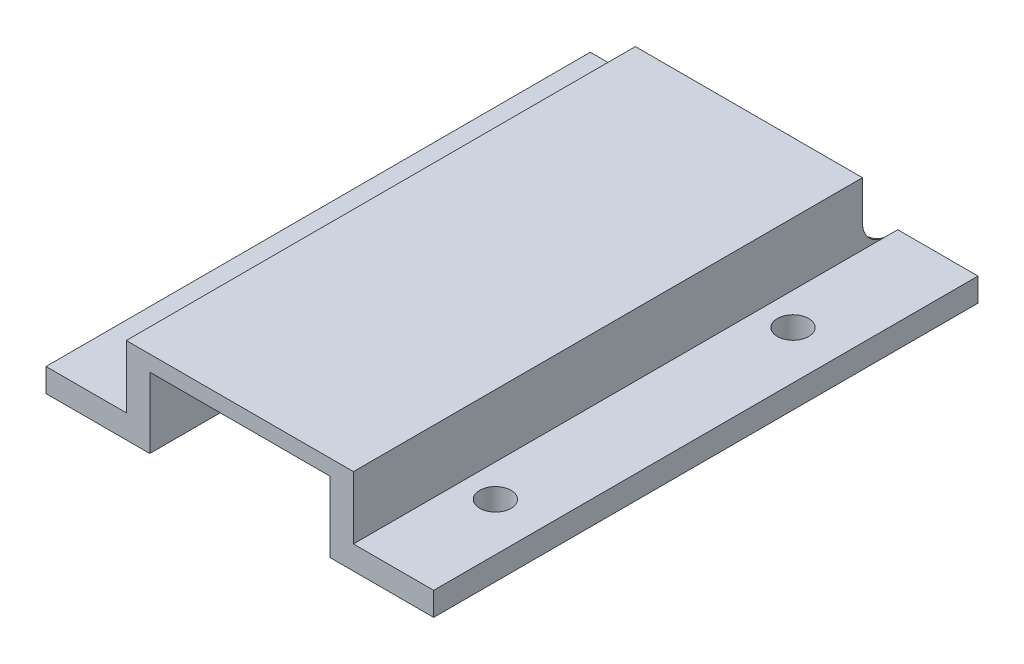
ISO-10303-21;
HEADER;
FILE_DESCRIPTION(('STEP AP214'),'2;1');
FILE_NAME('part.step','',(''),(''),'','','');
FILE_SCHEMA(('AUTOMOTIVE_DESIGN { 1 0 10303 214 1 1 1 1 }'));
ENDSEC;
DATA;
#1=APPLICATION_CONTEXT('core data for automotive mechanical design processes');
#2=APPLICATION_PROTOCOL_DEFINITION('international standard','automotive_design',2000,#1);
#3=PRODUCT_CONTEXT('',#1,'mechanical');
#4=PRODUCT('Part','Part','',(#3));
#5=PRODUCT_RELATED_PRODUCT_CATEGORY('part','',(#4));
#6=PRODUCT_DEFINITION_FORMATION('','',#4);
#7=PRODUCT_DEFINITION_CONTEXT('part definition',#1,'design');
#8=PRODUCT_DEFINITION('design','',#6,#7);
#9=PRODUCT_DEFINITION_SHAPE('','',#8);
#10=(LENGTH_UNIT() NAMED_UNIT(*) SI_UNIT(.MILLI.,.METRE.));
#11=(NAMED_UNIT(*) PLANE_ANGLE_UNIT() SI_UNIT($,.RADIAN.));
#12=(NAMED_UNIT(*) SI_UNIT($,.STERADIAN.) SOLID_ANGLE_UNIT());
#13=UNCERTAINTY_MEASURE_WITH_UNIT(LENGTH_MEASURE(1.E-05),#10,'distance_accuracy_value','');
#14=(GEOMETRIC_REPRESENTATION_CONTEXT(3) GLOBAL_UNCERTAINTY_ASSIGNED_CONTEXT((#13)) GLOBAL_UNIT_ASSIGNED_CONTEXT((#10,
#11,#12)) REPRESENTATION_CONTEXT('',''));
#15=CARTESIAN_POINT('',(0.,0.,0.));
#16=DIRECTION('',(0.,0.,1.));
#17=DIRECTION('',(1.,0.,0.));
#18=AXIS2_PLACEMENT_3D('',#15,#16,#17);
#19=CARTESIAN_POINT('',(0.,0.,-69.5));
#20=DIRECTION('',(0.,0.,-1.));
#21=DIRECTION('',(-1.,0.,0.));
#22=AXIS2_PLACEMENT_3D('',#19,#20,#21);
#23=PLANE('',#22);
#24=DIRECTION('',(0.,1.,0.));
#25=VECTOR('',#24,1.);
#26=CARTESIAN_POINT('',(-12.8,0.,-69.5));
#27=LINE('',#26,#25);
#28=CARTESIAN_POINT('',(-12.8,0.,-69.5));
#29=VERTEX_POINT('',#28);
#30=CARTESIAN_POINT('',(-12.8,3.,-69.5));
#31=VERTEX_POINT('',#30);
#32=EDGE_CURVE('E186',#29,#31,#27,.T.);
#33=ORIENTED_EDGE('',*,*,#32,.F.);
#34=DIRECTION('',(1.,0.,0.));
#35=VECTOR('',#34,1.);
#36=CARTESIAN_POINT('',(-23.05,0.,-69.5));
#37=LINE('',#36,#35);
#38=CARTESIAN_POINT('',(-23.05,0.,-69.5));
#39=VERTEX_POINT('',#38);
#40=EDGE_CURVE('E194',#39,#29,#37,.T.);
#41=ORIENTED_EDGE('',*,*,#40,.F.);
#42=DIRECTION('',(0.,-1.,0.));
#43=VECTOR('',#42,1.);
#44=CARTESIAN_POINT('',(-23.05,3.,-69.5));
#45=LINE('',#44,#43);
#46=CARTESIAN_POINT('',(-23.05,3.,-69.5));
#47=VERTEX_POINT('',#46);
#48=EDGE_CURVE('E195',#47,#39,#45,.T.);
#49=ORIENTED_EDGE('',*,*,#48,.F.);
#50=DIRECTION('',(-1.,0.,0.));
#51=VECTOR('',#50,1.);
#52=CARTESIAN_POINT('',(-12.8,3.,-69.5));
#53=LINE('',#52,#51);
#54=EDGE_CURVE('E201',#31,#47,#53,.T.);
#55=ORIENTED_EDGE('',*,*,#54,.F.);
#56=EDGE_LOOP('',(#33,#41,#49,#55));
#57=FACE_BOUND('',#56,.T.);
#58=ADVANCED_FACE('F45',(#57),#23,.T.);
#59=CARTESIAN_POINT('',(-23.05,0.,-69.5));
#60=DIRECTION('',(0.,-1.,0.));
#61=DIRECTION('',(0.,0.,-1.));
#62=AXIS2_PLACEMENT_3D('',#59,#60,#61);
#63=PLANE('',#62);
#64=DIRECTION('',(0.,0.,1.));
#65=VECTOR('',#64,1.);
#66=CARTESIAN_POINT('',(-12.8,0.,-69.5));
#67=LINE('',#66,#65);
#68=CARTESIAN_POINT('',(-12.8,0.,-68.));
#69=VERTEX_POINT('',#68);
#70=EDGE_CURVE('E175',#29,#69,#67,.T.);
#71=ORIENTED_EDGE('',*,*,#70,.T.);
#72=CARTESIAN_POINT('',(-9.8,0.,-68.));
#73=DIRECTION('',(0.,-1.,0.));
#74=DIRECTION('',(0.,0.,-1.));
#75=AXIS2_PLACEMENT_3D('',#72,#73,#74);
#76=CIRCLE('',#75,3.);
#77=CARTESIAN_POINT('',(-9.8,0.,-65.));
#78=VERTEX_POINT('',#77);
#79=EDGE_CURVE('E281',#69,#78,#76,.F.);
#80=ORIENTED_EDGE('',*,*,#79,.T.);
#81=DIRECTION('',(0.,0.,1.));
#82=VECTOR('',#81,1.);
#83=CARTESIAN_POINT('',(-9.8,0.,-69.5));
#84=LINE('',#83,#82);
#85=CARTESIAN_POINT('',(-9.8,0.,0.));
#86=VERTEX_POINT('',#85);
#87=EDGE_CURVE('E378',#78,#86,#84,.T.);
#88=ORIENTED_EDGE('',*,*,#87,.T.);
#89=DIRECTION('',(1.,0.,0.));
#90=VECTOR('',#89,1.);
#91=CARTESIAN_POINT('',(-23.05,0.,0.));
#92=LINE('',#91,#90);
#93=CARTESIAN_POINT('',(-23.05,0.,0.));
#94=VERTEX_POINT('',#93);
#95=EDGE_CURVE('E234',#94,#86,#92,.T.);
#96=ORIENTED_EDGE('',*,*,#95,.F.);
#97=DIRECTION('',(0.,0.,1.));
#98=VECTOR('',#97,1.);
#99=CARTESIAN_POINT('',(-23.05,0.,-69.5));
#100=LINE('',#99,#98);
#101=EDGE_CURVE('E250',#39,#94,#100,.T.);
#102=ORIENTED_EDGE('',*,*,#101,.F.);
#103=ORIENTED_EDGE('',*,*,#40,.T.);
#104=EDGE_LOOP('',(#71,#80,#88,#96,#102,#103));
#105=FACE_BOUND('',#104,.T.);
#106=CARTESIAN_POINT('',(-16.93,0.,-14.));
#107=DIRECTION('',(0.,1.,0.));
#108=DIRECTION('',(-1.,0.,0.));
#109=AXIS2_PLACEMENT_3D('',#106,#107,#108);
#110=CIRCLE('',#109,2.00000000000001);
#111=CARTESIAN_POINT('',(-18.93,0.,-14.));
#112=VERTEX_POINT('',#111);
#113=EDGE_CURVE('E340',#112,#112,#110,.T.);
#114=ORIENTED_EDGE('',*,*,#113,.T.);
#115=EDGE_LOOP('',(#114));
#116=FACE_BOUND('',#115,.T.);
#117=CARTESIAN_POINT('',(-16.93,0.,-52.));
#118=DIRECTION('',(0.,1.,0.));
#119=DIRECTION('',(-1.,0.,0.));
#120=AXIS2_PLACEMENT_3D('',#117,#118,#119);
#121=CIRCLE('',#120,2.);
#122=CARTESIAN_POINT('',(-18.93,0.,-52.));
#123=VERTEX_POINT('',#122);
#124=EDGE_CURVE('E359',#123,#123,#121,.T.);
#125=ORIENTED_EDGE('',*,*,#124,.T.);
#126=EDGE_LOOP('',(#125));
#127=FACE_BOUND('',#126,.T.);
#128=ADVANCED_FACE('F433',(#105,#116,#127),#63,.T.);
#129=CARTESIAN_POINT('',(16.2,3.00000000000001,-69.5));
#130=DIRECTION('',(0.,1.,0.));
#131=DIRECTION('',(-1.,0.,0.));
#132=AXIS2_PLACEMENT_3D('',#129,#130,#131);
#133=PLANE('',#132);
#134=CARTESIAN_POINT('',(20.33,3.,-52.));
#135=DIRECTION('',(0.,1.,0.));
#136=DIRECTION('',(1.,0.,0.));
#137=AXIS2_PLACEMENT_3D('',#134,#135,#136);
#138=CIRCLE('',#137,2.);
#139=CARTESIAN_POINT('',(22.33,3.,-52.));
#140=VERTEX_POINT('',#139);
#141=EDGE_CURVE('E352',#140,#140,#138,.T.);
#142=ORIENTED_EDGE('',*,*,#141,.F.);
#143=EDGE_LOOP('',(#142));
#144=FACE_BOUND('',#143,.T.);
#145=CARTESIAN_POINT('',(20.33,3.,-14.));
#146=DIRECTION('',(0.,1.,0.));
#147=DIRECTION('',(1.,0.,0.));
#148=AXIS2_PLACEMENT_3D('',#145,#146,#147);
#149=CIRCLE('',#148,2.00000000000001);
#150=CARTESIAN_POINT('',(22.33,3.,-14.));
#151=VERTEX_POINT('',#150);
#152=EDGE_CURVE('E344',#151,#151,#149,.T.);
#153=ORIENTED_EDGE('',*,*,#152,.F.);
#154=EDGE_LOOP('',(#153));
#155=FACE_BOUND('',#154,.T.);
#156=DIRECTION('',(0.,0.,1.));
#157=VECTOR('',#156,1.);
#158=CARTESIAN_POINT('',(16.2,3.00000000000001,-69.5));
#159=LINE('',#158,#157);
#160=CARTESIAN_POINT('',(16.2,3.00000000000001,-69.5));
#161=VERTEX_POINT('',#160);
#162=CARTESIAN_POINT('',(16.2,3.00000000000001,-68.));
#163=VERTEX_POINT('',#162);
#164=EDGE_CURVE('E181',#161,#163,#159,.T.);
#165=ORIENTED_EDGE('',*,*,#164,.T.);
#166=CARTESIAN_POINT('',(16.2,3.00000000000001,0.));
#167=VERTEX_POINT('',#166);
#168=EDGE_CURVE('E207',#163,#167,#159,.T.);
#169=ORIENTED_EDGE('',*,*,#168,.T.);
#170=DIRECTION('',(-1.,0.,0.));
#171=VECTOR('',#170,1.);
#172=CARTESIAN_POINT('',(16.2,3.00000000000001,0.));
#173=LINE('',#172,#171);
#174=CARTESIAN_POINT('',(26.45,3.00000000000001,0.));
#175=VERTEX_POINT('',#174);
#176=EDGE_CURVE('E208',#175,#167,#173,.T.);
#177=ORIENTED_EDGE('',*,*,#176,.F.);
#178=DIRECTION('',(0.,0.,1.));
#179=VECTOR('',#178,1.);
#180=CARTESIAN_POINT('',(26.45,3.00000000000001,-69.5));
#181=LINE('',#180,#179);
#182=CARTESIAN_POINT('',(26.45,3.00000000000001,-69.5));
#183=VERTEX_POINT('',#182);
#184=EDGE_CURVE('E243',#183,#175,#181,.T.);
#185=ORIENTED_EDGE('',*,*,#184,.F.);
#186=DIRECTION('',(-1.,0.,0.));
#187=VECTOR('',#186,1.);
#188=CARTESIAN_POINT('',(16.2,3.00000000000001,-69.5));
#189=LINE('',#188,#187);
#190=EDGE_CURVE('E242',#183,#161,#189,.T.);
#191=ORIENTED_EDGE('',*,*,#190,.T.);
#192=EDGE_LOOP('',(#165,#169,#177,#185,#191));
#193=FACE_BOUND('',#192,.T.);
#194=ADVANCED_FACE('F309',(#144,#155,#193),#133,.T.);
#195=CARTESIAN_POINT('',(26.45,3.00000000000001,-69.5));
#196=DIRECTION('',(1.,0.,0.));
#197=DIRECTION('',(0.,0.,-1.));
#198=AXIS2_PLACEMENT_3D('',#195,#196,#197);
#199=PLANE('',#198);
#200=DIRECTION('',(0.,1.,0.));
#201=VECTOR('',#200,1.);
#202=CARTESIAN_POINT('',(26.45,3.00000000000001,0.));
#203=LINE('',#202,#201);
#204=CARTESIAN_POINT('',(26.45,0.,0.));
#205=VERTEX_POINT('',#204);
#206=EDGE_CURVE('E238',#205,#175,#203,.T.);
#207=ORIENTED_EDGE('',*,*,#206,.F.);
#208=DIRECTION('',(0.,0.,1.));
#209=VECTOR('',#208,1.);
#210=CARTESIAN_POINT('',(26.45,0.,-69.5));
#211=LINE('',#210,#209);
#212=CARTESIAN_POINT('',(26.45,0.,-69.5));
#213=VERTEX_POINT('',#212);
#214=EDGE_CURVE('E247',#213,#205,#211,.T.);
#215=ORIENTED_EDGE('',*,*,#214,.F.);
#216=DIRECTION('',(0.,1.,0.));
#217=VECTOR('',#216,1.);
#218=CARTESIAN_POINT('',(26.45,3.00000000000001,-69.5));
#219=LINE('',#218,#217);
#220=EDGE_CURVE('E192',#213,#183,#219,.T.);
#221=ORIENTED_EDGE('',*,*,#220,.T.);
#222=ORIENTED_EDGE('',*,*,#184,.T.);
#223=EDGE_LOOP('',(#207,#215,#221,#222));
#224=FACE_BOUND('',#223,.T.);
#225=ADVANCED_FACE('F448',(#224),#199,.T.);
#226=DIRECTION('',(0.,0.,1.));
#227=VECTOR('',#226,1.);
#228=CARTESIAN_POINT('',(13.2,0.,-69.5));
#229=LINE('',#228,#227);
#230=CARTESIAN_POINT('',(13.2,0.,-65.));
#231=VERTEX_POINT('',#230);
#232=CARTESIAN_POINT('',(13.2,0.,0.));
#233=VERTEX_POINT('',#232);
#234=EDGE_CURVE('E384',#231,#233,#229,.T.);
#235=ORIENTED_EDGE('',*,*,#234,.F.);
#236=CARTESIAN_POINT('',(13.2,0.,-68.));
#237=DIRECTION('',(0.,-1.,0.));
#238=DIRECTION('',(0.,0.,-1.));
#239=AXIS2_PLACEMENT_3D('',#236,#237,#238);
#240=CIRCLE('',#239,3.);
#241=CARTESIAN_POINT('',(16.2,0.,-68.));
#242=VERTEX_POINT('',#241);
#243=EDGE_CURVE('E169',#231,#242,#240,.F.);
#244=ORIENTED_EDGE('',*,*,#243,.T.);
#245=DIRECTION('',(0.,0.,-1.));
#246=VECTOR('',#245,1.);
#247=CARTESIAN_POINT('',(16.2,0.,-69.5));
#248=LINE('',#247,#246);
#249=CARTESIAN_POINT('',(16.2,0.,-69.5));
#250=VERTEX_POINT('',#249);
#251=EDGE_CURVE('E159',#242,#250,#248,.T.);
#252=ORIENTED_EDGE('',*,*,#251,.T.);
#253=EDGE_CURVE('E166',#250,#213,#37,.T.);
#254=ORIENTED_EDGE('',*,*,#253,.T.);
#255=ORIENTED_EDGE('',*,*,#214,.T.);
#256=EDGE_CURVE('E233',#233,#205,#92,.T.);
#257=ORIENTED_EDGE('',*,*,#256,.F.);
#258=EDGE_LOOP('',(#235,#244,#252,#254,#255,#257));
#259=FACE_BOUND('',#258,.T.);
#260=CARTESIAN_POINT('',(20.33,0.,-52.));
#261=DIRECTION('',(0.,1.,0.));
#262=DIRECTION('',(1.,0.,0.));
#263=AXIS2_PLACEMENT_3D('',#260,#261,#262);
#264=CIRCLE('',#263,2.);
#265=CARTESIAN_POINT('',(22.33,0.,-52.));
#266=VERTEX_POINT('',#265);
#267=EDGE_CURVE('E334',#266,#266,#264,.T.);
#268=ORIENTED_EDGE('',*,*,#267,.T.);
#269=EDGE_LOOP('',(#268));
#270=FACE_BOUND('',#269,.T.);
#271=CARTESIAN_POINT('',(20.33,0.,-14.));
#272=DIRECTION('',(0.,1.,0.));
#273=DIRECTION('',(1.,0.,0.));
#274=AXIS2_PLACEMENT_3D('',#271,#272,#273);
#275=CIRCLE('',#274,2.00000000000001);
#276=CARTESIAN_POINT('',(22.33,0.,-14.));
#277=VERTEX_POINT('',#276);
#278=EDGE_CURVE('E348',#277,#277,#275,.T.);
#279=ORIENTED_EDGE('',*,*,#278,.T.);
#280=EDGE_LOOP('',(#279));
#281=FACE_BOUND('',#280,.T.);
#282=ADVANCED_FACE('F162',(#259,#270,#281),#63,.T.);
#283=CARTESIAN_POINT('',(-23.05,3.,-69.5));
#284=DIRECTION('',(-1.,0.,0.));
#285=DIRECTION('',(0.,0.,1.));
#286=AXIS2_PLACEMENT_3D('',#283,#284,#285);
#287=PLANE('',#286);
#288=DIRECTION('',(0.,-1.,0.));
#289=VECTOR('',#288,1.);
#290=CARTESIAN_POINT('',(-23.05,3.,0.));
#291=LINE('',#290,#289);
#292=CARTESIAN_POINT('',(-23.05,3.,0.));
#293=VERTEX_POINT('',#292);
#294=EDGE_CURVE('E229',#293,#94,#291,.T.);
#295=ORIENTED_EDGE('',*,*,#294,.F.);
#296=DIRECTION('',(0.,0.,1.));
#297=VECTOR('',#296,1.);
#298=CARTESIAN_POINT('',(-23.05,3.,-69.5));
#299=LINE('',#298,#297);
#300=EDGE_CURVE('E253',#47,#293,#299,.T.);
#301=ORIENTED_EDGE('',*,*,#300,.F.);
#302=ORIENTED_EDGE('',*,*,#48,.T.);
#303=ORIENTED_EDGE('',*,*,#101,.T.);
#304=EDGE_LOOP('',(#295,#301,#302,#303));
#305=FACE_BOUND('',#304,.T.);
#306=ADVANCED_FACE('F403',(#305),#287,.T.);
#307=CARTESIAN_POINT('',(-12.8,3.,-69.5));
#308=DIRECTION('',(0.,1.,0.));
#309=DIRECTION('',(-1.,0.,0.));
#310=AXIS2_PLACEMENT_3D('',#307,#308,#309);
#311=PLANE('',#310);
#312=CARTESIAN_POINT('',(-16.93,3.,-14.));
#313=DIRECTION('',(0.,1.,0.));
#314=DIRECTION('',(-1.,0.,0.));
#315=AXIS2_PLACEMENT_3D('',#312,#313,#314);
#316=CIRCLE('',#315,2.00000000000001);
#317=CARTESIAN_POINT('',(-18.93,3.,-14.));
#318=VERTEX_POINT('',#317);
#319=EDGE_CURVE('E335',#318,#318,#316,.T.);
#320=ORIENTED_EDGE('',*,*,#319,.F.);
#321=EDGE_LOOP('',(#320));
#322=FACE_BOUND('',#321,.T.);
#323=CARTESIAN_POINT('',(-16.93,3.,-52.));
#324=DIRECTION('',(0.,1.,0.));
#325=DIRECTION('',(-1.,0.,0.));
#326=AXIS2_PLACEMENT_3D('',#323,#324,#325);
#327=CIRCLE('',#326,2.);
#328=CARTESIAN_POINT('',(-18.93,3.,-52.));
#329=VERTEX_POINT('',#328);
#330=EDGE_CURVE('E339',#329,#329,#327,.T.);
#331=ORIENTED_EDGE('',*,*,#330,.F.);
#332=EDGE_LOOP('',(#331));
#333=FACE_BOUND('',#332,.T.);
#334=DIRECTION('',(0.,0.,1.));
#335=VECTOR('',#334,1.);
#336=CARTESIAN_POINT('',(-12.8,3.,-69.5));
#337=LINE('',#336,#335);
#338=CARTESIAN_POINT('',(-12.8,3.,-68.));
#339=VERTEX_POINT('',#338);
#340=CARTESIAN_POINT('',(-12.8,3.,0.));
#341=VERTEX_POINT('',#340);
#342=EDGE_CURVE('E260',#339,#341,#337,.T.);
#343=ORIENTED_EDGE('',*,*,#342,.F.);
#344=EDGE_CURVE('E256',#31,#339,#337,.T.);
#345=ORIENTED_EDGE('',*,*,#344,.F.);
#346=ORIENTED_EDGE('',*,*,#54,.T.);
#347=ORIENTED_EDGE('',*,*,#300,.T.);
#348=DIRECTION('',(-1.,0.,0.));
#349=VECTOR('',#348,1.);
#350=CARTESIAN_POINT('',(-12.8,3.,0.));
#351=LINE('',#350,#349);
#352=EDGE_CURVE('E225',#341,#293,#351,.T.);
#353=ORIENTED_EDGE('',*,*,#352,.F.);
#354=EDGE_LOOP('',(#343,#345,#346,#347,#353));
#355=FACE_BOUND('',#354,.T.);
#356=ADVANCED_FACE('F395',(#322,#333,#355),#311,.T.);
#357=CARTESIAN_POINT('',(-12.8,11.,-69.5));
#358=DIRECTION('',(-1.,0.,0.));
#359=DIRECTION('',(0.,-1.,0.));
#360=AXIS2_PLACEMENT_3D('',#357,#358,#359);
#361=PLANE('',#360);
#362=DIRECTION('',(0.,1.,0.));
#363=VECTOR('',#362,1.);
#364=CARTESIAN_POINT('',(-12.8,0.,-65.));
#365=LINE('',#364,#363);
#366=CARTESIAN_POINT('',(-12.8,6.,-65.));
#367=VERTEX_POINT('',#366);
#368=CARTESIAN_POINT('',(-12.8,11.,-65.));
#369=VERTEX_POINT('',#368);
#370=EDGE_CURVE('E174',#367,#369,#365,.T.);
#371=ORIENTED_EDGE('',*,*,#370,.F.);
#372=CARTESIAN_POINT('',(-12.8,6.,-68.));
#373=DIRECTION('',(-1.,0.,0.));
#374=DIRECTION('',(0.,-1.,0.));
#375=AXIS2_PLACEMENT_3D('',#372,#373,#374);
#376=CIRCLE('',#375,3.);
#377=EDGE_CURVE('E292',#367,#339,#376,.F.);
#378=ORIENTED_EDGE('',*,*,#377,.T.);
#379=ORIENTED_EDGE('',*,*,#342,.T.);
#380=DIRECTION('',(0.,-1.,0.));
#381=VECTOR('',#380,1.);
#382=CARTESIAN_POINT('',(-12.8,11.,0.));
#383=LINE('',#382,#381);
#384=CARTESIAN_POINT('',(-12.8,11.,0.));
#385=VERTEX_POINT('',#384);
#386=EDGE_CURVE('E221',#385,#341,#383,.T.);
#387=ORIENTED_EDGE('',*,*,#386,.F.);
#388=DIRECTION('',(0.,0.,1.));
#389=VECTOR('',#388,1.);
#390=CARTESIAN_POINT('',(-12.8,11.,-69.5));
#391=LINE('',#390,#389);
#392=EDGE_CURVE('E261',#369,#385,#391,.T.);
#393=ORIENTED_EDGE('',*,*,#392,.F.);
#394=EDGE_LOOP('',(#371,#378,#379,#387,#393));
#395=FACE_BOUND('',#394,.T.);
#396=ADVANCED_FACE('F411',(#395),#361,.T.);
#397=CARTESIAN_POINT('',(16.2,11.,-69.5));
#398=DIRECTION('',(0.,1.,0.));
#399=DIRECTION('',(-1.,0.,0.));
#400=AXIS2_PLACEMENT_3D('',#397,#398,#399);
#401=PLANE('',#400);
#402=DIRECTION('',(1.,0.,0.));
#403=VECTOR('',#402,1.);
#404=CARTESIAN_POINT('',(-12.8,11.,-65.));
#405=LINE('',#404,#403);
#406=CARTESIAN_POINT('',(16.2,11.,-65.));
#407=VERTEX_POINT('',#406);
#408=EDGE_CURVE('E319',#369,#407,#405,.T.);
#409=ORIENTED_EDGE('',*,*,#408,.F.);
#410=ORIENTED_EDGE('',*,*,#392,.T.);
#411=DIRECTION('',(-1.,0.,0.));
#412=VECTOR('',#411,1.);
#413=CARTESIAN_POINT('',(16.2,11.,0.));
#414=LINE('',#413,#412);
#415=CARTESIAN_POINT('',(16.2,11.,0.));
#416=VERTEX_POINT('',#415);
#417=EDGE_CURVE('E217',#416,#385,#414,.T.);
#418=ORIENTED_EDGE('',*,*,#417,.F.);
#419=DIRECTION('',(0.,0.,1.));
#420=VECTOR('',#419,1.);
#421=CARTESIAN_POINT('',(16.2,11.,-69.5));
#422=LINE('',#421,#420);
#423=EDGE_CURVE('E264',#407,#416,#422,.T.);
#424=ORIENTED_EDGE('',*,*,#423,.F.);
#425=EDGE_LOOP('',(#409,#410,#418,#424));
#426=FACE_BOUND('',#425,.T.);
#427=ADVANCED_FACE('F451',(#426),#401,.T.);
#428=CARTESIAN_POINT('',(16.2,11.,-69.5));
#429=DIRECTION('',(1.,0.,0.));
#430=DIRECTION('',(0.,0.,-1.));
#431=AXIS2_PLACEMENT_3D('',#428,#429,#430);
#432=PLANE('',#431);
#433=ORIENTED_EDGE('',*,*,#168,.F.);
#434=CARTESIAN_POINT('',(16.2,6.00000000000001,-68.));
#435=DIRECTION('',(1.,0.,0.));
#436=DIRECTION('',(0.,0.,-1.));
#437=AXIS2_PLACEMENT_3D('',#434,#435,#436);
#438=CIRCLE('',#437,3.);
#439=CARTESIAN_POINT('',(16.2,6.00000000000001,-65.));
#440=VERTEX_POINT('',#439);
#441=EDGE_CURVE('E11',#163,#440,#438,.F.);
#442=ORIENTED_EDGE('',*,*,#441,.T.);
#443=DIRECTION('',(0.,1.,0.));
#444=VECTOR('',#443,1.);
#445=CARTESIAN_POINT('',(16.2,0.,-65.));
#446=LINE('',#445,#444);
#447=EDGE_CURVE('E187',#440,#407,#446,.T.);
#448=ORIENTED_EDGE('',*,*,#447,.T.);
#449=ORIENTED_EDGE('',*,*,#423,.T.);
#450=DIRECTION('',(0.,1.,0.));
#451=VECTOR('',#450,1.);
#452=CARTESIAN_POINT('',(16.2,11.,0.));
#453=LINE('',#452,#451);
#454=EDGE_CURVE('E212',#167,#416,#453,.T.);
#455=ORIENTED_EDGE('',*,*,#454,.F.);
#456=EDGE_LOOP('',(#433,#442,#448,#449,#455));
#457=FACE_BOUND('',#456,.T.);
#458=ADVANCED_FACE('F314',(#457),#432,.T.);
#459=DIRECTION('',(0.,1.,0.));
#460=VECTOR('',#459,1.);
#461=CARTESIAN_POINT('',(16.2,0.,-69.5));
#462=LINE('',#461,#460);
#463=EDGE_CURVE('E178',#250,#161,#462,.T.);
#464=ORIENTED_EDGE('',*,*,#463,.T.);
#465=ORIENTED_EDGE('',*,*,#190,.F.);
#466=ORIENTED_EDGE('',*,*,#220,.F.);
#467=ORIENTED_EDGE('',*,*,#253,.F.);
#468=EDGE_LOOP('',(#464,#465,#466,#467));
#469=FACE_BOUND('',#468,.T.);
#470=ADVANCED_FACE('F190',(#469),#23,.T.);
#471=CARTESIAN_POINT('',(0.,0.,0.));
#472=DIRECTION('',(0.,0.,-1.));
#473=DIRECTION('',(-1.,0.,0.));
#474=AXIS2_PLACEMENT_3D('',#471,#472,#473);
#475=PLANE('',#474);
#476=ORIENTED_EDGE('',*,*,#95,.T.);
#477=DIRECTION('',(0.,-1.,0.));
#478=VECTOR('',#477,1.);
#479=CARTESIAN_POINT('',(-9.8,0.,0.));
#480=LINE('',#479,#478);
#481=CARTESIAN_POINT('',(-9.8,9.,0.));
#482=VERTEX_POINT('',#481);
#483=EDGE_CURVE('E363',#482,#86,#480,.T.);
#484=ORIENTED_EDGE('',*,*,#483,.F.);
#485=DIRECTION('',(-1.,0.,0.));
#486=VECTOR('',#485,1.);
#487=CARTESIAN_POINT('',(-9.8,9.,0.));
#488=LINE('',#487,#486);
#489=CARTESIAN_POINT('',(13.2,9.,0.));
#490=VERTEX_POINT('',#489);
#491=EDGE_CURVE('E374',#490,#482,#488,.T.);
#492=ORIENTED_EDGE('',*,*,#491,.F.);
#493=DIRECTION('',(0.,1.,0.));
#494=VECTOR('',#493,1.);
#495=CARTESIAN_POINT('',(13.2,0.,0.));
#496=LINE('',#495,#494);
#497=EDGE_CURVE('E370',#233,#490,#496,.T.);
#498=ORIENTED_EDGE('',*,*,#497,.F.);
#499=ORIENTED_EDGE('',*,*,#256,.T.);
#500=ORIENTED_EDGE('',*,*,#206,.T.);
#501=ORIENTED_EDGE('',*,*,#176,.T.);
#502=ORIENTED_EDGE('',*,*,#454,.T.);
#503=ORIENTED_EDGE('',*,*,#417,.T.);
#504=ORIENTED_EDGE('',*,*,#386,.T.);
#505=ORIENTED_EDGE('',*,*,#352,.T.);
#506=ORIENTED_EDGE('',*,*,#294,.T.);
#507=EDGE_LOOP('',(#476,#484,#492,#498,#499,#500,#501,#502,#503,#504,#505,#506));
#508=FACE_BOUND('',#507,.T.);
#509=ADVANCED_FACE('F406',(#508),#475,.F.);
#510=CARTESIAN_POINT('',(-9.8,0.,-69.5));
#511=DIRECTION('',(-1.,0.,0.));
#512=DIRECTION('',(0.,0.,1.));
#513=AXIS2_PLACEMENT_3D('',#510,#511,#512);
#514=PLANE('',#513);
#515=ORIENTED_EDGE('',*,*,#87,.F.);
#516=DIRECTION('',(0.,1.,0.));
#517=VECTOR('',#516,1.);
#518=CARTESIAN_POINT('',(-9.8,0.,-65.));
#519=LINE('',#518,#517);
#520=CARTESIAN_POINT('',(-9.8,6.,-65.));
#521=VERTEX_POINT('',#520);
#522=EDGE_CURVE('E62',#78,#521,#519,.T.);
#523=ORIENTED_EDGE('',*,*,#522,.T.);
#524=CARTESIAN_POINT('',(-9.8,9.,-65.));
#525=VERTEX_POINT('',#524);
#526=EDGE_CURVE('E331',#521,#525,#519,.T.);
#527=ORIENTED_EDGE('',*,*,#526,.T.);
#528=DIRECTION('',(0.,0.,1.));
#529=VECTOR('',#528,1.);
#530=CARTESIAN_POINT('',(-9.8,9.,-69.5));
#531=LINE('',#530,#529);
#532=EDGE_CURVE('E213',#525,#482,#531,.T.);
#533=ORIENTED_EDGE('',*,*,#532,.T.);
#534=ORIENTED_EDGE('',*,*,#483,.T.);
#535=EDGE_LOOP('',(#515,#523,#527,#533,#534));
#536=FACE_BOUND('',#535,.T.);
#537=ADVANCED_FACE('F438',(#536),#514,.F.);
#538=CARTESIAN_POINT('',(-9.8,9.,-69.5));
#539=DIRECTION('',(0.,1.,0.));
#540=DIRECTION('',(-1.,0.,0.));
#541=AXIS2_PLACEMENT_3D('',#538,#539,#540);
#542=PLANE('',#541);
#543=ORIENTED_EDGE('',*,*,#532,.F.);
#544=DIRECTION('',(1.,0.,0.));
#545=VECTOR('',#544,1.);
#546=CARTESIAN_POINT('',(-9.8,9.,-65.));
#547=LINE('',#546,#545);
#548=CARTESIAN_POINT('',(13.2,9.,-65.));
#549=VERTEX_POINT('',#548);
#550=EDGE_CURVE('E327',#525,#549,#547,.T.);
#551=ORIENTED_EDGE('',*,*,#550,.T.);
#552=DIRECTION('',(0.,0.,1.));
#553=VECTOR('',#552,1.);
#554=CARTESIAN_POINT('',(13.2,9.,-69.5));
#555=LINE('',#554,#553);
#556=EDGE_CURVE('E381',#549,#490,#555,.T.);
#557=ORIENTED_EDGE('',*,*,#556,.T.);
#558=ORIENTED_EDGE('',*,*,#491,.T.);
#559=EDGE_LOOP('',(#543,#551,#557,#558));
#560=FACE_BOUND('',#559,.T.);
#561=ADVANCED_FACE('F440',(#560),#542,.F.);
#562=CARTESIAN_POINT('',(13.2,0.,-69.5));
#563=DIRECTION('',(1.,0.,0.));
#564=DIRECTION('',(0.,1.,0.));
#565=AXIS2_PLACEMENT_3D('',#562,#563,#564);
#566=PLANE('',#565);
#567=ORIENTED_EDGE('',*,*,#556,.F.);
#568=DIRECTION('',(0.,-1.,0.));
#569=VECTOR('',#568,1.);
#570=CARTESIAN_POINT('',(13.2,0.,-65.));
#571=LINE('',#570,#569);
#572=CARTESIAN_POINT('',(13.2,6.00000000000001,-65.));
#573=VERTEX_POINT('',#572);
#574=EDGE_CURVE('E269',#549,#573,#571,.T.);
#575=ORIENTED_EDGE('',*,*,#574,.T.);
#576=EDGE_CURVE('E246',#573,#231,#571,.T.);
#577=ORIENTED_EDGE('',*,*,#576,.T.);
#578=ORIENTED_EDGE('',*,*,#234,.T.);
#579=ORIENTED_EDGE('',*,*,#497,.T.);
#580=EDGE_LOOP('',(#567,#575,#577,#578,#579));
#581=FACE_BOUND('',#580,.T.);
#582=ADVANCED_FACE('F443',(#581),#566,.F.);
#583=CARTESIAN_POINT('',(-16.93,0.,-52.));
#584=DIRECTION('',(0.,1.,0.));
#585=DIRECTION('',(-1.,0.,0.));
#586=AXIS2_PLACEMENT_3D('',#583,#584,#585);
#587=CYLINDRICAL_SURFACE('',#586,2.);
#588=ORIENTED_EDGE('',*,*,#124,.F.);
#589=EDGE_LOOP('',(#588));
#590=FACE_BOUND('',#589,.T.);
#591=ORIENTED_EDGE('',*,*,#330,.T.);
#592=EDGE_LOOP('',(#591));
#593=FACE_BOUND('',#592,.T.);
#594=ADVANCED_FACE('F493',(#590,#593),#587,.F.);
#595=CARTESIAN_POINT('',(-16.93,0.,-14.));
#596=DIRECTION('',(0.,1.,0.));
#597=DIRECTION('',(-1.,0.,0.));
#598=AXIS2_PLACEMENT_3D('',#595,#596,#597);
#599=CYLINDRICAL_SURFACE('',#598,2.00000000000001);
#600=ORIENTED_EDGE('',*,*,#113,.F.);
#601=EDGE_LOOP('',(#600));
#602=FACE_BOUND('',#601,.T.);
#603=ORIENTED_EDGE('',*,*,#319,.T.);
#604=EDGE_LOOP('',(#603));
#605=FACE_BOUND('',#604,.T.);
#606=ADVANCED_FACE('F494',(#602,#605),#599,.F.);
#607=CARTESIAN_POINT('',(20.33,0.,-14.));
#608=DIRECTION('',(0.,1.,0.));
#609=DIRECTION('',(-1.,0.,0.));
#610=AXIS2_PLACEMENT_3D('',#607,#608,#609);
#611=CYLINDRICAL_SURFACE('',#610,2.00000000000001);
#612=ORIENTED_EDGE('',*,*,#278,.F.);
#613=EDGE_LOOP('',(#612));
#614=FACE_BOUND('',#613,.T.);
#615=ORIENTED_EDGE('',*,*,#152,.T.);
#616=EDGE_LOOP('',(#615));
#617=FACE_BOUND('',#616,.T.);
#618=ADVANCED_FACE('F500',(#614,#617),#611,.F.);
#619=CARTESIAN_POINT('',(20.33,0.,-52.));
#620=DIRECTION('',(0.,1.,0.));
#621=DIRECTION('',(-1.,0.,0.));
#622=AXIS2_PLACEMENT_3D('',#619,#620,#621);
#623=CYLINDRICAL_SURFACE('',#622,2.);
#624=ORIENTED_EDGE('',*,*,#267,.F.);
#625=EDGE_LOOP('',(#624));
#626=FACE_BOUND('',#625,.T.);
#627=ORIENTED_EDGE('',*,*,#141,.T.);
#628=EDGE_LOOP('',(#627));
#629=FACE_BOUND('',#628,.T.);
#630=ADVANCED_FACE('F508',(#626,#629),#623,.F.);
#631=CARTESIAN_POINT('',(-12.8,0.,-65.));
#632=DIRECTION('',(0.,0.,1.));
#633=DIRECTION('',(1.,0.,0.));
#634=AXIS2_PLACEMENT_3D('',#631,#632,#633);
#635=PLANE('',#634);
#636=ORIENTED_EDGE('',*,*,#526,.F.);
#637=DIRECTION('',(-1.,0.,0.));
#638=VECTOR('',#637,1.);
#639=CARTESIAN_POINT('',(-12.8,6.,-65.));
#640=LINE('',#639,#638);
#641=EDGE_CURVE('E288',#521,#367,#640,.T.);
#642=ORIENTED_EDGE('',*,*,#641,.T.);
#643=ORIENTED_EDGE('',*,*,#370,.T.);
#644=ORIENTED_EDGE('',*,*,#408,.T.);
#645=ORIENTED_EDGE('',*,*,#447,.F.);
#646=DIRECTION('',(-1.,0.,0.));
#647=VECTOR('',#646,1.);
#648=CARTESIAN_POINT('',(-12.8,6.00000000000001,-65.));
#649=LINE('',#648,#647);
#650=EDGE_CURVE('E284',#440,#573,#649,.T.);
#651=ORIENTED_EDGE('',*,*,#650,.T.);
#652=ORIENTED_EDGE('',*,*,#574,.F.);
#653=ORIENTED_EDGE('',*,*,#550,.F.);
#654=EDGE_LOOP('',(#636,#642,#643,#644,#645,#651,#652,#653));
#655=FACE_BOUND('',#654,.T.);
#656=ADVANCED_FACE('F317',(#655),#635,.F.);
#657=CARTESIAN_POINT('',(-12.8,0.,-69.5));
#658=DIRECTION('',(-1.,0.,0.));
#659=DIRECTION('',(0.,-1.,0.));
#660=AXIS2_PLACEMENT_3D('',#657,#658,#659);
#661=PLANE('',#660);
#662=ORIENTED_EDGE('',*,*,#344,.T.);
#663=DIRECTION('',(0.,1.,0.));
#664=VECTOR('',#663,1.);
#665=CARTESIAN_POINT('',(-12.8,0.,-68.));
#666=LINE('',#665,#664);
#667=EDGE_CURVE('E276',#339,#69,#666,.F.);
#668=ORIENTED_EDGE('',*,*,#667,.T.);
#669=ORIENTED_EDGE('',*,*,#70,.F.);
#670=ORIENTED_EDGE('',*,*,#32,.T.);
#671=EDGE_LOOP('',(#662,#668,#669,#670));
#672=FACE_BOUND('',#671,.T.);
#673=ADVANCED_FACE('F418',(#672),#661,.F.);
#674=CARTESIAN_POINT('',(16.2,0.,-69.5));
#675=DIRECTION('',(1.,0.,0.));
#676=DIRECTION('',(0.,1.,0.));
#677=AXIS2_PLACEMENT_3D('',#674,#675,#676);
#678=PLANE('',#677);
#679=ORIENTED_EDGE('',*,*,#251,.F.);
#680=DIRECTION('',(0.,1.,0.));
#681=VECTOR('',#680,1.);
#682=CARTESIAN_POINT('',(16.2,3.00000000000001,-68.));
#683=LINE('',#682,#681);
#684=EDGE_CURVE('E273',#242,#163,#683,.T.);
#685=ORIENTED_EDGE('',*,*,#684,.T.);
#686=ORIENTED_EDGE('',*,*,#164,.F.);
#687=ORIENTED_EDGE('',*,*,#463,.F.);
#688=EDGE_LOOP('',(#679,#685,#686,#687));
#689=FACE_BOUND('',#688,.T.);
#690=ADVANCED_FACE('F179',(#689),#678,.F.);
#691=CARTESIAN_POINT('',(13.2,0.,-68.));
#692=DIRECTION('',(0.,-1.,0.));
#693=DIRECTION('',(1.,0.,0.));
#694=AXIS2_PLACEMENT_3D('',#691,#692,#693);
#695=CYLINDRICAL_SURFACE('',#694,3.);
#696=ORIENTED_EDGE('',*,*,#243,.F.);
#697=ORIENTED_EDGE('',*,*,#576,.F.);
#698=CARTESIAN_POINT('',(13.2,6.00000000000001,-68.));
#699=DIRECTION('',(-0.707106781186547,-0.707106781186548,0.));
#700=DIRECTION('',(0.707106781186548,-0.707106781186547,0.));
#701=AXIS2_PLACEMENT_3D('',#698,#699,#700);
#702=ELLIPSE('',#701,4.24264068711929,3.);
#703=EDGE_CURVE('E55',#573,#163,#702,.F.);
#704=ORIENTED_EDGE('',*,*,#703,.T.);
#705=ORIENTED_EDGE('',*,*,#684,.F.);
#706=EDGE_LOOP('',(#696,#697,#704,#705));
#707=FACE_BOUND('',#706,.T.);
#708=ADVANCED_FACE('F304',(#707),#695,.F.);
#709=CARTESIAN_POINT('',(-9.8,0.,-68.));
#710=DIRECTION('',(0.,-1.,0.));
#711=DIRECTION('',(1.,0.,0.));
#712=AXIS2_PLACEMENT_3D('',#709,#710,#711);
#713=CYLINDRICAL_SURFACE('',#712,3.);
#714=ORIENTED_EDGE('',*,*,#79,.F.);
#715=ORIENTED_EDGE('',*,*,#667,.F.);
#716=CARTESIAN_POINT('',(-9.8,6.,-68.));
#717=DIRECTION('',(0.707106781186548,-0.707106781186547,0.));
#718=DIRECTION('',(-0.707106781186547,-0.707106781186548,0.));
#719=AXIS2_PLACEMENT_3D('',#716,#717,#718);
#720=ELLIPSE('',#719,4.24264068711928,3.);
#721=EDGE_CURVE('E296',#339,#521,#720,.F.);
#722=ORIENTED_EDGE('',*,*,#721,.T.);
#723=ORIENTED_EDGE('',*,*,#522,.F.);
#724=EDGE_LOOP('',(#714,#715,#722,#723));
#725=FACE_BOUND('',#724,.T.);
#726=ADVANCED_FACE('F422',(#725),#713,.F.);
#727=CARTESIAN_POINT('',(-12.8,6.,-68.));
#728=DIRECTION('',(-1.,0.,0.));
#729=DIRECTION('',(0.,-1.,0.));
#730=AXIS2_PLACEMENT_3D('',#727,#728,#729);
#731=CYLINDRICAL_SURFACE('',#730,3.);
#732=ORIENTED_EDGE('',*,*,#641,.F.);
#733=ORIENTED_EDGE('',*,*,#721,.F.);
#734=ORIENTED_EDGE('',*,*,#377,.F.);
#735=EDGE_LOOP('',(#732,#733,#734));
#736=FACE_BOUND('',#735,.T.);
#737=ADVANCED_FACE('F423',(#736),#731,.F.);
#738=CARTESIAN_POINT('',(-12.8,6.00000000000001,-68.));
#739=DIRECTION('',(-1.,0.,0.));
#740=DIRECTION('',(0.,-1.,0.));
#741=AXIS2_PLACEMENT_3D('',#738,#739,#740);
#742=CYLINDRICAL_SURFACE('',#741,3.);
#743=ORIENTED_EDGE('',*,*,#650,.F.);
#744=ORIENTED_EDGE('',*,*,#441,.F.);
#745=ORIENTED_EDGE('',*,*,#703,.F.);
#746=EDGE_LOOP('',(#743,#744,#745));
#747=FACE_BOUND('',#746,.T.);
#748=ADVANCED_FACE('F47',(#747),#742,.F.);
#749=CLOSED_SHELL('',(#58,#128,#194,#225,#282,#306,#356,#396,#427,#458,#470,#509,#537,#561,#582,
#594,#606,#618,#630,#656,#673,#690,#708,#726,#737,#748));
#750=MANIFOLD_SOLID_BREP('B2',#749);
#751=ADVANCED_BREP_SHAPE_REPRESENTATION('',(#18,#750),#14);
#752=SHAPE_DEFINITION_REPRESENTATION(#9,#751);
ENDSEC;
END-ISO-10303-21;
